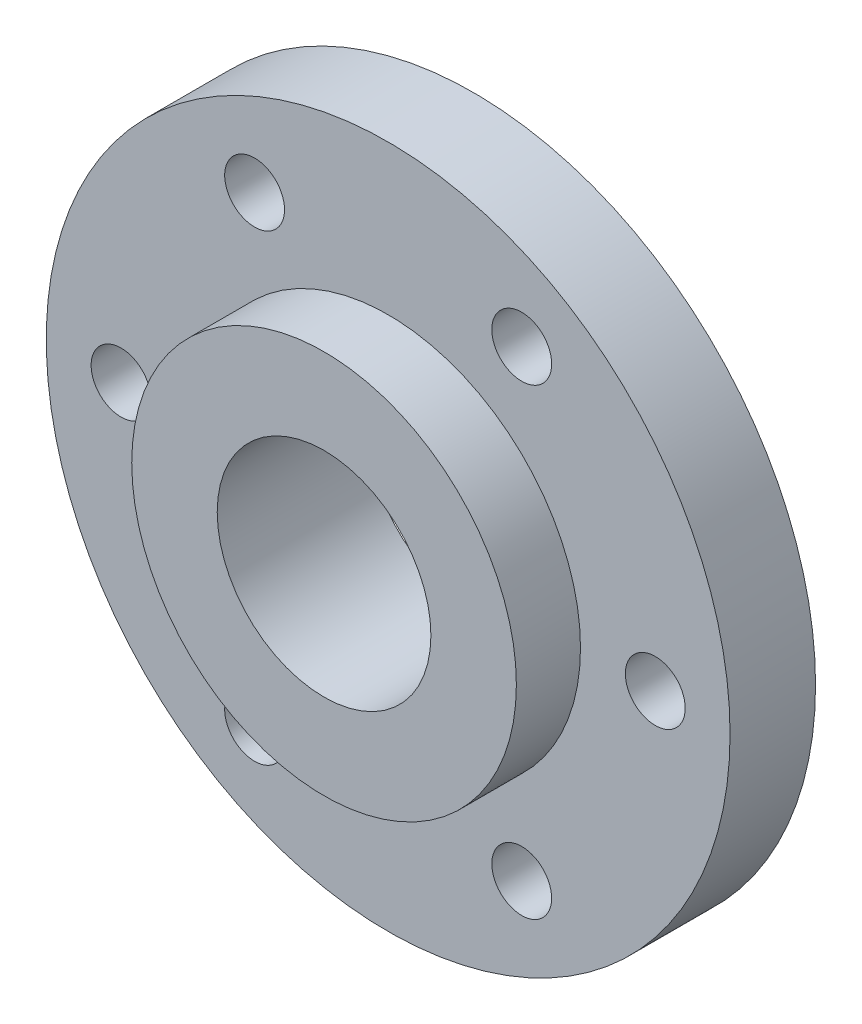
ISO-10303-21;
HEADER;
FILE_DESCRIPTION(('STEP AP214'),'2;1');
FILE_NAME('part.step','',(''),(''),'','','');
FILE_SCHEMA(('AUTOMOTIVE_DESIGN { 1 0 10303 214 1 1 1 1 }'));
ENDSEC;
DATA;
#1=APPLICATION_CONTEXT('core data for automotive mechanical design processes');
#2=APPLICATION_PROTOCOL_DEFINITION('international standard','automotive_design',2000,#1);
#3=PRODUCT_CONTEXT('',#1,'mechanical');
#4=PRODUCT('Part','Part','',(#3));
#5=PRODUCT_RELATED_PRODUCT_CATEGORY('part','',(#4));
#6=PRODUCT_DEFINITION_FORMATION('','',#4);
#7=PRODUCT_DEFINITION_CONTEXT('part definition',#1,'design');
#8=PRODUCT_DEFINITION('design','',#6,#7);
#9=PRODUCT_DEFINITION_SHAPE('','',#8);
#10=(LENGTH_UNIT() NAMED_UNIT(*) SI_UNIT(.MILLI.,.METRE.));
#11=(NAMED_UNIT(*) PLANE_ANGLE_UNIT() SI_UNIT($,.RADIAN.));
#12=(NAMED_UNIT(*) SI_UNIT($,.STERADIAN.) SOLID_ANGLE_UNIT());
#13=UNCERTAINTY_MEASURE_WITH_UNIT(LENGTH_MEASURE(1.E-05),#10,'distance_accuracy_value','');
#14=(GEOMETRIC_REPRESENTATION_CONTEXT(3) GLOBAL_UNCERTAINTY_ASSIGNED_CONTEXT((#13)) GLOBAL_UNIT_ASSIGNED_CONTEXT((#10,
#11,#12)) REPRESENTATION_CONTEXT('',''));
#15=CARTESIAN_POINT('',(0.,0.,0.));
#16=DIRECTION('',(0.,0.,1.));
#17=DIRECTION('',(1.,0.,0.));
#18=AXIS2_PLACEMENT_3D('',#15,#16,#17);
#19=CARTESIAN_POINT('',(0.,0.,0.));
#20=DIRECTION('',(0.,0.,1.));
#21=DIRECTION('',(1.,0.,0.));
#22=AXIS2_PLACEMENT_3D('',#19,#20,#21);
#23=PLANE('',#22);
#24=CARTESIAN_POINT('',(62.5,0.,0.));
#25=DIRECTION('',(0.,0.,1.));
#26=DIRECTION('',(1.,0.,0.));
#27=AXIS2_PLACEMENT_3D('',#24,#25,#26);
#28=CIRCLE('',#27,7.);
#29=CARTESIAN_POINT('',(69.5,0.,0.));
#30=VERTEX_POINT('',#29);
#31=EDGE_CURVE('E55',#30,#30,#28,.F.);
#32=ORIENTED_EDGE('',*,*,#31,.T.);
#33=EDGE_LOOP('',(#32));
#34=FACE_BOUND('',#33,.T.);
#35=CARTESIAN_POINT('',(31.25,-54.1265877365274,0.));
#36=DIRECTION('',(0.,0.,1.));
#37=DIRECTION('',(1.,0.,0.));
#38=AXIS2_PLACEMENT_3D('',#35,#36,#37);
#39=CIRCLE('',#38,7.);
#40=CARTESIAN_POINT('',(38.25,-54.1265877365274,0.));
#41=VERTEX_POINT('',#40);
#42=EDGE_CURVE('E58',#41,#41,#39,.F.);
#43=ORIENTED_EDGE('',*,*,#42,.T.);
#44=EDGE_LOOP('',(#43));
#45=FACE_BOUND('',#44,.T.);
#46=CARTESIAN_POINT('',(-31.25,-54.1265877365274,0.));
#47=DIRECTION('',(0.,0.,1.));
#48=DIRECTION('',(1.,0.,0.));
#49=AXIS2_PLACEMENT_3D('',#46,#47,#48);
#50=CIRCLE('',#49,6.99999999999996);
#51=CARTESIAN_POINT('',(-24.25,-54.1265877365274,0.));
#52=VERTEX_POINT('',#51);
#53=EDGE_CURVE('E61',#52,#52,#50,.F.);
#54=ORIENTED_EDGE('',*,*,#53,.T.);
#55=EDGE_LOOP('',(#54));
#56=FACE_BOUND('',#55,.T.);
#57=CARTESIAN_POINT('',(-62.5,0.,0.));
#58=DIRECTION('',(0.,0.,1.));
#59=DIRECTION('',(1.,0.,0.));
#60=AXIS2_PLACEMENT_3D('',#57,#58,#59);
#61=CIRCLE('',#60,7.);
#62=CARTESIAN_POINT('',(-55.5,0.,0.));
#63=VERTEX_POINT('',#62);
#64=EDGE_CURVE('E64',#63,#63,#61,.F.);
#65=ORIENTED_EDGE('',*,*,#64,.T.);
#66=EDGE_LOOP('',(#65));
#67=FACE_BOUND('',#66,.T.);
#68=CARTESIAN_POINT('',(-31.25,54.1265877365274,0.));
#69=DIRECTION('',(0.,0.,1.));
#70=DIRECTION('',(1.,0.,0.));
#71=AXIS2_PLACEMENT_3D('',#68,#69,#70);
#72=CIRCLE('',#71,7.);
#73=CARTESIAN_POINT('',(-24.25,54.1265877365274,0.));
#74=VERTEX_POINT('',#73);
#75=EDGE_CURVE('E67',#74,#74,#72,.F.);
#76=ORIENTED_EDGE('',*,*,#75,.T.);
#77=EDGE_LOOP('',(#76));
#78=FACE_BOUND('',#77,.T.);
#79=CARTESIAN_POINT('',(31.25,54.1265877365274,0.));
#80=DIRECTION('',(0.,0.,1.));
#81=DIRECTION('',(1.,0.,0.));
#82=AXIS2_PLACEMENT_3D('',#79,#80,#81);
#83=CIRCLE('',#82,7.);
#84=CARTESIAN_POINT('',(38.25,54.1265877365274,0.));
#85=VERTEX_POINT('',#84);
#86=EDGE_CURVE('E70',#85,#85,#83,.F.);
#87=ORIENTED_EDGE('',*,*,#86,.T.);
#88=EDGE_LOOP('',(#87));
#89=FACE_BOUND('',#88,.T.);
#90=CARTESIAN_POINT('',(0.,0.,0.));
#91=DIRECTION('',(0.,0.,1.));
#92=DIRECTION('',(1.,0.,0.));
#93=AXIS2_PLACEMENT_3D('',#90,#91,#92);
#94=CIRCLE('',#93,80.);
#95=CARTESIAN_POINT('',(80.,0.,0.));
#96=VERTEX_POINT('',#95);
#97=EDGE_CURVE('E35',#96,#96,#94,.T.);
#98=ORIENTED_EDGE('',*,*,#97,.T.);
#99=EDGE_LOOP('',(#98));
#100=FACE_BOUND('',#99,.T.);
#101=CARTESIAN_POINT('',(0.,0.,0.));
#102=DIRECTION('',(0.,0.,1.));
#103=DIRECTION('',(1.,0.,0.));
#104=AXIS2_PLACEMENT_3D('',#101,#102,#103);
#105=CIRCLE('',#104,45.);
#106=CARTESIAN_POINT('',(45.,0.,0.));
#107=VERTEX_POINT('',#106);
#108=EDGE_CURVE('E47',#107,#107,#105,.T.);
#109=ORIENTED_EDGE('',*,*,#108,.F.);
#110=EDGE_LOOP('',(#109));
#111=FACE_BOUND('',#110,.T.);
#112=ADVANCED_FACE('F31',(#34,#45,#56,#67,#78,#89,#100,#111),#23,.T.);
#113=CARTESIAN_POINT('',(0.,0.,-20.));
#114=DIRECTION('',(0.,0.,1.));
#115=DIRECTION('',(1.,0.,0.));
#116=AXIS2_PLACEMENT_3D('',#113,#114,#115);
#117=CYLINDRICAL_SURFACE('',#116,80.);
#118=CARTESIAN_POINT('',(0.,0.,-20.));
#119=DIRECTION('',(0.,0.,1.));
#120=DIRECTION('',(1.,0.,0.));
#121=AXIS2_PLACEMENT_3D('',#118,#119,#120);
#122=CIRCLE('',#121,80.);
#123=CARTESIAN_POINT('',(80.,0.,-20.));
#124=VERTEX_POINT('',#123);
#125=EDGE_CURVE('E10',#124,#124,#122,.T.);
#126=ORIENTED_EDGE('',*,*,#125,.T.);
#127=EDGE_LOOP('',(#126));
#128=FACE_BOUND('',#127,.T.);
#129=ORIENTED_EDGE('',*,*,#97,.F.);
#130=EDGE_LOOP('',(#129));
#131=FACE_BOUND('',#130,.T.);
#132=ADVANCED_FACE('F33',(#128,#131),#117,.T.);
#133=CARTESIAN_POINT('',(0.,0.,-20.));
#134=DIRECTION('',(0.,0.,1.));
#135=DIRECTION('',(1.,0.,0.));
#136=AXIS2_PLACEMENT_3D('',#133,#134,#135);
#137=PLANE('',#136);
#138=CARTESIAN_POINT('',(62.5,0.,-20.));
#139=DIRECTION('',(0.,0.,1.));
#140=DIRECTION('',(1.,0.,0.));
#141=AXIS2_PLACEMENT_3D('',#138,#139,#140);
#142=CIRCLE('',#141,7.);
#143=CARTESIAN_POINT('',(69.5,0.,-20.));
#144=VERTEX_POINT('',#143);
#145=EDGE_CURVE('E73',#144,#144,#142,.T.);
#146=ORIENTED_EDGE('',*,*,#145,.T.);
#147=EDGE_LOOP('',(#146));
#148=FACE_BOUND('',#147,.T.);
#149=CARTESIAN_POINT('',(31.25,-54.1265877365274,-20.));
#150=DIRECTION('',(0.,0.,1.));
#151=DIRECTION('',(1.,0.,0.));
#152=AXIS2_PLACEMENT_3D('',#149,#150,#151);
#153=CIRCLE('',#152,7.);
#154=CARTESIAN_POINT('',(38.25,-54.1265877365274,-20.));
#155=VERTEX_POINT('',#154);
#156=EDGE_CURVE('E78',#155,#155,#153,.T.);
#157=ORIENTED_EDGE('',*,*,#156,.T.);
#158=EDGE_LOOP('',(#157));
#159=FACE_BOUND('',#158,.T.);
#160=CARTESIAN_POINT('',(-31.25,-54.1265877365274,-20.));
#161=DIRECTION('',(0.,0.,1.));
#162=DIRECTION('',(1.,0.,0.));
#163=AXIS2_PLACEMENT_3D('',#160,#161,#162);
#164=CIRCLE('',#163,6.99999999999996);
#165=CARTESIAN_POINT('',(-24.25,-54.1265877365274,-20.));
#166=VERTEX_POINT('',#165);
#167=EDGE_CURVE('E74',#166,#166,#164,.T.);
#168=ORIENTED_EDGE('',*,*,#167,.T.);
#169=EDGE_LOOP('',(#168));
#170=FACE_BOUND('',#169,.T.);
#171=CARTESIAN_POINT('',(-62.5,0.,-20.));
#172=DIRECTION('',(0.,0.,1.));
#173=DIRECTION('',(1.,0.,0.));
#174=AXIS2_PLACEMENT_3D('',#171,#172,#173);
#175=CIRCLE('',#174,7.);
#176=CARTESIAN_POINT('',(-55.5,0.,-20.));
#177=VERTEX_POINT('',#176);
#178=EDGE_CURVE('E77',#177,#177,#175,.T.);
#179=ORIENTED_EDGE('',*,*,#178,.T.);
#180=EDGE_LOOP('',(#179));
#181=FACE_BOUND('',#180,.T.);
#182=CARTESIAN_POINT('',(-31.25,54.1265877365274,-20.));
#183=DIRECTION('',(0.,0.,1.));
#184=DIRECTION('',(1.,0.,0.));
#185=AXIS2_PLACEMENT_3D('',#182,#183,#184);
#186=CIRCLE('',#185,7.);
#187=CARTESIAN_POINT('',(-24.25,54.1265877365274,-20.));
#188=VERTEX_POINT('',#187);
#189=EDGE_CURVE('E81',#188,#188,#186,.T.);
#190=ORIENTED_EDGE('',*,*,#189,.T.);
#191=EDGE_LOOP('',(#190));
#192=FACE_BOUND('',#191,.T.);
#193=CARTESIAN_POINT('',(31.25,54.1265877365274,-20.));
#194=DIRECTION('',(0.,0.,1.));
#195=DIRECTION('',(1.,0.,0.));
#196=AXIS2_PLACEMENT_3D('',#193,#194,#195);
#197=CIRCLE('',#196,7.);
#198=CARTESIAN_POINT('',(38.25,54.1265877365274,-20.));
#199=VERTEX_POINT('',#198);
#200=EDGE_CURVE('E84',#199,#199,#197,.T.);
#201=ORIENTED_EDGE('',*,*,#200,.T.);
#202=EDGE_LOOP('',(#201));
#203=FACE_BOUND('',#202,.T.);
#204=CARTESIAN_POINT('',(0.,0.,-20.));
#205=DIRECTION('',(0.,0.,1.));
#206=DIRECTION('',(1.,0.,0.));
#207=AXIS2_PLACEMENT_3D('',#204,#205,#206);
#208=CIRCLE('',#207,25.);
#209=CARTESIAN_POINT('',(25.,0.,-20.));
#210=VERTEX_POINT('',#209);
#211=EDGE_CURVE('E42',#210,#210,#208,.T.);
#212=ORIENTED_EDGE('',*,*,#211,.T.);
#213=EDGE_LOOP('',(#212));
#214=FACE_BOUND('',#213,.T.);
#215=ORIENTED_EDGE('',*,*,#125,.F.);
#216=EDGE_LOOP('',(#215));
#217=FACE_BOUND('',#216,.T.);
#218=ADVANCED_FACE('F92',(#148,#159,#170,#181,#192,#203,#214,#217),#137,.F.);
#219=CARTESIAN_POINT('',(0.,0.,-20.));
#220=DIRECTION('',(0.,0.,1.));
#221=DIRECTION('',(1.,0.,0.));
#222=AXIS2_PLACEMENT_3D('',#219,#220,#221);
#223=CYLINDRICAL_SURFACE('',#222,25.);
#224=ORIENTED_EDGE('',*,*,#211,.F.);
#225=EDGE_LOOP('',(#224));
#226=FACE_BOUND('',#225,.T.);
#227=CARTESIAN_POINT('',(0.,0.,15.));
#228=DIRECTION('',(0.,0.,1.));
#229=DIRECTION('',(1.,0.,0.));
#230=AXIS2_PLACEMENT_3D('',#227,#228,#229);
#231=CIRCLE('',#230,25.);
#232=CARTESIAN_POINT('',(25.,0.,15.));
#233=VERTEX_POINT('',#232);
#234=EDGE_CURVE('E50',#233,#233,#231,.T.);
#235=ORIENTED_EDGE('',*,*,#234,.T.);
#236=EDGE_LOOP('',(#235));
#237=FACE_BOUND('',#236,.T.);
#238=ADVANCED_FACE('F116',(#226,#237),#223,.F.);
#239=CARTESIAN_POINT('',(0.,0.,15.));
#240=DIRECTION('',(0.,0.,1.));
#241=DIRECTION('',(1.,0.,0.));
#242=AXIS2_PLACEMENT_3D('',#239,#240,#241);
#243=PLANE('',#242);
#244=CARTESIAN_POINT('',(0.,0.,15.));
#245=DIRECTION('',(0.,0.,1.));
#246=DIRECTION('',(1.,0.,0.));
#247=AXIS2_PLACEMENT_3D('',#244,#245,#246);
#248=CIRCLE('',#247,45.);
#249=CARTESIAN_POINT('',(45.,0.,15.));
#250=VERTEX_POINT('',#249);
#251=EDGE_CURVE('E46',#250,#250,#248,.T.);
#252=ORIENTED_EDGE('',*,*,#251,.T.);
#253=EDGE_LOOP('',(#252));
#254=FACE_BOUND('',#253,.T.);
#255=ORIENTED_EDGE('',*,*,#234,.F.);
#256=EDGE_LOOP('',(#255));
#257=FACE_BOUND('',#256,.T.);
#258=ADVANCED_FACE('F119',(#254,#257),#243,.T.);
#259=CARTESIAN_POINT('',(0.,0.,15.));
#260=DIRECTION('',(0.,0.,-1.));
#261=DIRECTION('',(-1.,0.,0.));
#262=AXIS2_PLACEMENT_3D('',#259,#260,#261);
#263=CYLINDRICAL_SURFACE('',#262,45.);
#264=ORIENTED_EDGE('',*,*,#251,.F.);
#265=EDGE_LOOP('',(#264));
#266=FACE_BOUND('',#265,.T.);
#267=ORIENTED_EDGE('',*,*,#108,.T.);
#268=EDGE_LOOP('',(#267));
#269=FACE_BOUND('',#268,.T.);
#270=ADVANCED_FACE('F121',(#266,#269),#263,.T.);
#271=CARTESIAN_POINT('',(31.25,54.1265877365274,15.));
#272=DIRECTION('',(0.,0.,-1.));
#273=DIRECTION('',(-1.,0.,0.));
#274=AXIS2_PLACEMENT_3D('',#271,#272,#273);
#275=CYLINDRICAL_SURFACE('',#274,7.);
#276=ORIENTED_EDGE('',*,*,#86,.F.);
#277=EDGE_LOOP('',(#276));
#278=FACE_BOUND('',#277,.T.);
#279=ORIENTED_EDGE('',*,*,#200,.F.);
#280=EDGE_LOOP('',(#279));
#281=FACE_BOUND('',#280,.T.);
#282=ADVANCED_FACE('F124',(#278,#281),#275,.F.);
#283=CARTESIAN_POINT('',(-31.25,54.1265877365274,15.));
#284=DIRECTION('',(0.,0.,-1.));
#285=DIRECTION('',(-1.,0.,0.));
#286=AXIS2_PLACEMENT_3D('',#283,#284,#285);
#287=CYLINDRICAL_SURFACE('',#286,7.);
#288=ORIENTED_EDGE('',*,*,#75,.F.);
#289=EDGE_LOOP('',(#288));
#290=FACE_BOUND('',#289,.T.);
#291=ORIENTED_EDGE('',*,*,#189,.F.);
#292=EDGE_LOOP('',(#291));
#293=FACE_BOUND('',#292,.T.);
#294=ADVANCED_FACE('F135',(#290,#293),#287,.F.);
#295=CARTESIAN_POINT('',(-62.5,0.,15.));
#296=DIRECTION('',(0.,0.,-1.));
#297=DIRECTION('',(-1.,0.,0.));
#298=AXIS2_PLACEMENT_3D('',#295,#296,#297);
#299=CYLINDRICAL_SURFACE('',#298,7.);
#300=ORIENTED_EDGE('',*,*,#64,.F.);
#301=EDGE_LOOP('',(#300));
#302=FACE_BOUND('',#301,.T.);
#303=ORIENTED_EDGE('',*,*,#178,.F.);
#304=EDGE_LOOP('',(#303));
#305=FACE_BOUND('',#304,.T.);
#306=ADVANCED_FACE('F131',(#302,#305),#299,.F.);
#307=CARTESIAN_POINT('',(-31.25,-54.1265877365274,15.));
#308=DIRECTION('',(0.,0.,-1.));
#309=DIRECTION('',(-1.,0.,0.));
#310=AXIS2_PLACEMENT_3D('',#307,#308,#309);
#311=CYLINDRICAL_SURFACE('',#310,6.99999999999996);
#312=ORIENTED_EDGE('',*,*,#53,.F.);
#313=EDGE_LOOP('',(#312));
#314=FACE_BOUND('',#313,.T.);
#315=ORIENTED_EDGE('',*,*,#167,.F.);
#316=EDGE_LOOP('',(#315));
#317=FACE_BOUND('',#316,.T.);
#318=ADVANCED_FACE('F103',(#314,#317),#311,.F.);
#319=CARTESIAN_POINT('',(31.25,-54.1265877365274,15.));
#320=DIRECTION('',(0.,0.,-1.));
#321=DIRECTION('',(-1.,0.,0.));
#322=AXIS2_PLACEMENT_3D('',#319,#320,#321);
#323=CYLINDRICAL_SURFACE('',#322,7.);
#324=ORIENTED_EDGE('',*,*,#42,.F.);
#325=EDGE_LOOP('',(#324));
#326=FACE_BOUND('',#325,.T.);
#327=ORIENTED_EDGE('',*,*,#156,.F.);
#328=EDGE_LOOP('',(#327));
#329=FACE_BOUND('',#328,.T.);
#330=ADVANCED_FACE('F97',(#326,#329),#323,.F.);
#331=CARTESIAN_POINT('',(62.5,0.,15.));
#332=DIRECTION('',(0.,0.,-1.));
#333=DIRECTION('',(-1.,0.,0.));
#334=AXIS2_PLACEMENT_3D('',#331,#332,#333);
#335=CYLINDRICAL_SURFACE('',#334,7.);
#336=ORIENTED_EDGE('',*,*,#31,.F.);
#337=EDGE_LOOP('',(#336));
#338=FACE_BOUND('',#337,.T.);
#339=ORIENTED_EDGE('',*,*,#145,.F.);
#340=EDGE_LOOP('',(#339));
#341=FACE_BOUND('',#340,.T.);
#342=ADVANCED_FACE('F95',(#338,#341),#335,.F.);
#343=CLOSED_SHELL('',(#112,#132,#218,#238,#258,#270,#282,#294,#306,#318,#330,#342));
#344=MANIFOLD_SOLID_BREP('B2',#343);
#345=ADVANCED_BREP_SHAPE_REPRESENTATION('',(#18,#344),#14);
#346=SHAPE_DEFINITION_REPRESENTATION(#9,#345);
ENDSEC;
END-ISO-10303-21;
